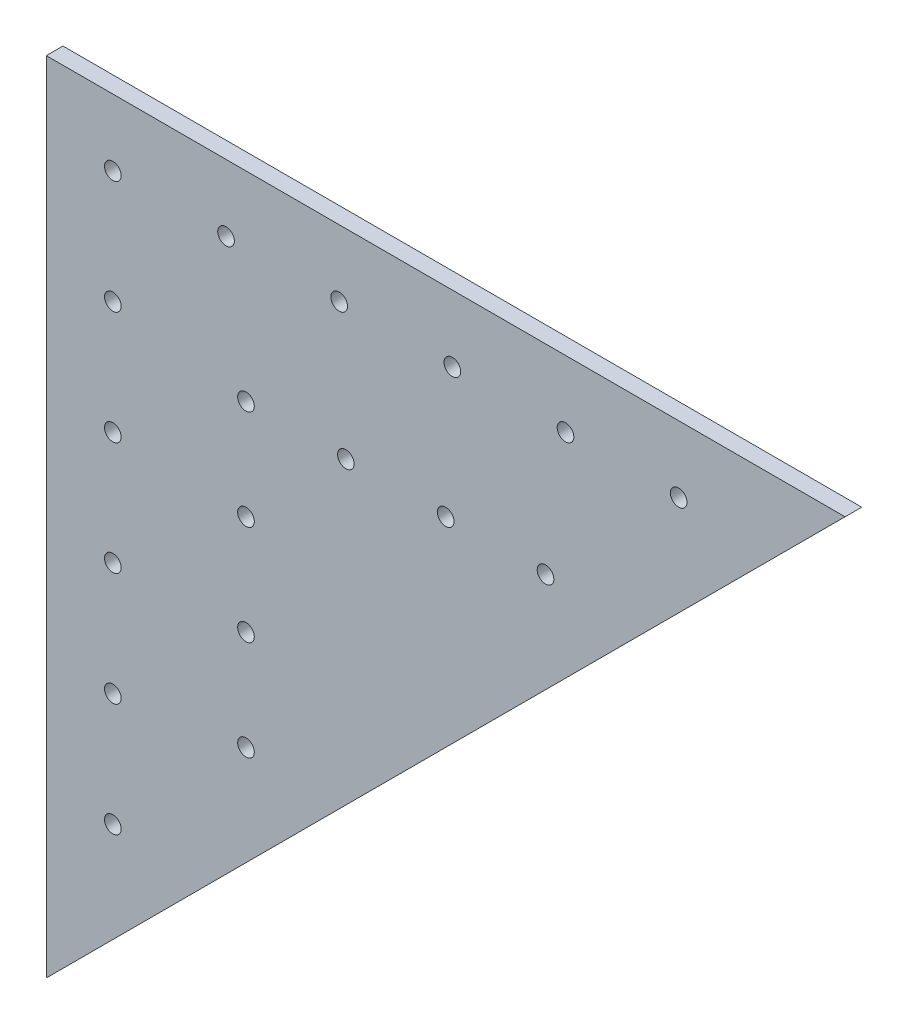
ISO-10303-21;
HEADER;
FILE_DESCRIPTION(('STEP AP214'),'2;1');
FILE_NAME('part.step','',(''),(''),'','','');
FILE_SCHEMA(('AUTOMOTIVE_DESIGN { 1 0 10303 214 1 1 1 1 }'));
ENDSEC;
DATA;
#1=APPLICATION_CONTEXT('core data for automotive mechanical design processes');
#2=APPLICATION_PROTOCOL_DEFINITION('international standard','automotive_design',2000,#1);
#3=PRODUCT_CONTEXT('',#1,'mechanical');
#4=PRODUCT('Part','Part','',(#3));
#5=PRODUCT_RELATED_PRODUCT_CATEGORY('part','',(#4));
#6=PRODUCT_DEFINITION_FORMATION('','',#4);
#7=PRODUCT_DEFINITION_CONTEXT('part definition',#1,'design');
#8=PRODUCT_DEFINITION('design','',#6,#7);
#9=PRODUCT_DEFINITION_SHAPE('','',#8);
#10=(LENGTH_UNIT() NAMED_UNIT(*) SI_UNIT(.MILLI.,.METRE.));
#11=(NAMED_UNIT(*) PLANE_ANGLE_UNIT() SI_UNIT($,.RADIAN.));
#12=(NAMED_UNIT(*) SI_UNIT($,.STERADIAN.) SOLID_ANGLE_UNIT());
#13=UNCERTAINTY_MEASURE_WITH_UNIT(LENGTH_MEASURE(1.E-05),#10,'distance_accuracy_value','');
#14=(GEOMETRIC_REPRESENTATION_CONTEXT(3) GLOBAL_UNCERTAINTY_ASSIGNED_CONTEXT((#13)) GLOBAL_UNIT_ASSIGNED_CONTEXT((#10,
#11,#12)) REPRESENTATION_CONTEXT('',''));
#15=CARTESIAN_POINT('',(0.,0.,0.));
#16=DIRECTION('',(0.,0.,1.));
#17=DIRECTION('',(1.,0.,0.));
#18=AXIS2_PLACEMENT_3D('',#15,#16,#17);
#19=CARTESIAN_POINT('',(152.4,152.4,3.175));
#20=DIRECTION('',(-0.707106781186548,0.707106781186548,0.));
#21=DIRECTION('',(-0.707106781186548,-0.707106781186548,0.));
#22=AXIS2_PLACEMENT_3D('',#19,#20,#21);
#23=PLANE('',#22);
#24=DIRECTION('',(0.707106781186547,0.707106781186547,0.));
#25=VECTOR('',#24,1.);
#26=CARTESIAN_POINT('',(152.4,152.4,0.));
#27=LINE('',#26,#25);
#28=CARTESIAN_POINT('',(0.,0.,0.));
#29=VERTEX_POINT('',#28);
#30=CARTESIAN_POINT('',(152.4,152.4,0.));
#31=VERTEX_POINT('',#30);
#32=EDGE_CURVE('E79',#29,#31,#27,.T.);
#33=ORIENTED_EDGE('',*,*,#32,.T.);
#34=DIRECTION('',(0.,0.,-1.));
#35=VECTOR('',#34,1.);
#36=CARTESIAN_POINT('',(152.4,152.4,3.175));
#37=LINE('',#36,#35);
#38=CARTESIAN_POINT('',(152.4,152.4,3.175));
#39=VERTEX_POINT('',#38);
#40=EDGE_CURVE('E11',#39,#31,#37,.T.);
#41=ORIENTED_EDGE('',*,*,#40,.F.);
#42=DIRECTION('',(0.707106781186547,0.707106781186547,0.));
#43=VECTOR('',#42,1.);
#44=CARTESIAN_POINT('',(152.4,152.4,3.175));
#45=LINE('',#44,#43);
#46=CARTESIAN_POINT('',(0.,0.,3.175));
#47=VERTEX_POINT('',#46);
#48=EDGE_CURVE('E72',#47,#39,#45,.T.);
#49=ORIENTED_EDGE('',*,*,#48,.F.);
#50=DIRECTION('',(0.,0.,-1.));
#51=VECTOR('',#50,1.);
#52=CARTESIAN_POINT('',(0.,0.,3.175));
#53=LINE('',#52,#51);
#54=EDGE_CURVE('E80',#47,#29,#53,.T.);
#55=ORIENTED_EDGE('',*,*,#54,.T.);
#56=EDGE_LOOP('',(#33,#41,#49,#55));
#57=FACE_BOUND('',#56,.T.);
#58=ADVANCED_FACE('F32',(#57),#23,.F.);
#59=CARTESIAN_POINT('',(0.,152.4,3.175));
#60=DIRECTION('',(0.,-1.,0.));
#61=DIRECTION('',(0.,0.,-1.));
#62=AXIS2_PLACEMENT_3D('',#59,#60,#61);
#63=PLANE('',#62);
#64=DIRECTION('',(-1.,0.,0.));
#65=VECTOR('',#64,1.);
#66=CARTESIAN_POINT('',(0.,152.4,0.));
#67=LINE('',#66,#65);
#68=CARTESIAN_POINT('',(0.,152.4,0.));
#69=VERTEX_POINT('',#68);
#70=EDGE_CURVE('E60',#31,#69,#67,.T.);
#71=ORIENTED_EDGE('',*,*,#70,.T.);
#72=DIRECTION('',(0.,0.,-1.));
#73=VECTOR('',#72,1.);
#74=CARTESIAN_POINT('',(0.,152.4,3.175));
#75=LINE('',#74,#73);
#76=CARTESIAN_POINT('',(0.,152.4,3.175));
#77=VERTEX_POINT('',#76);
#78=EDGE_CURVE('E40',#77,#69,#75,.T.);
#79=ORIENTED_EDGE('',*,*,#78,.F.);
#80=DIRECTION('',(-1.,0.,0.));
#81=VECTOR('',#80,1.);
#82=CARTESIAN_POINT('',(0.,152.4,3.175));
#83=LINE('',#82,#81);
#84=EDGE_CURVE('E68',#39,#77,#83,.T.);
#85=ORIENTED_EDGE('',*,*,#84,.F.);
#86=ORIENTED_EDGE('',*,*,#40,.T.);
#87=EDGE_LOOP('',(#71,#79,#85,#86));
#88=FACE_BOUND('',#87,.T.);
#89=ADVANCED_FACE('F69',(#88),#63,.F.);
#90=CARTESIAN_POINT('',(0.,0.,3.175));
#91=DIRECTION('',(1.,0.,0.));
#92=DIRECTION('',(0.,0.,-1.));
#93=AXIS2_PLACEMENT_3D('',#90,#91,#92);
#94=PLANE('',#93);
#95=DIRECTION('',(0.,-1.,0.));
#96=VECTOR('',#95,1.);
#97=CARTESIAN_POINT('',(0.,0.,0.));
#98=LINE('',#97,#96);
#99=EDGE_CURVE('E65',#69,#29,#98,.T.);
#100=ORIENTED_EDGE('',*,*,#99,.T.);
#101=ORIENTED_EDGE('',*,*,#54,.F.);
#102=DIRECTION('',(0.,-1.,0.));
#103=VECTOR('',#102,1.);
#104=CARTESIAN_POINT('',(0.,0.,3.175));
#105=LINE('',#104,#103);
#106=EDGE_CURVE('E48',#77,#47,#105,.T.);
#107=ORIENTED_EDGE('',*,*,#106,.F.);
#108=ORIENTED_EDGE('',*,*,#78,.T.);
#109=EDGE_LOOP('',(#100,#101,#107,#108));
#110=FACE_BOUND('',#109,.T.);
#111=ADVANCED_FACE('F91',(#110),#94,.F.);
#112=CARTESIAN_POINT('',(0.,0.,3.175));
#113=DIRECTION('',(0.,0.,-1.));
#114=DIRECTION('',(-1.,0.,0.));
#115=AXIS2_PLACEMENT_3D('',#112,#113,#114);
#116=PLANE('',#115);
#117=CARTESIAN_POINT('',(12.7,53.34,3.175));
#118=DIRECTION('',(0.,0.,1.));
#119=DIRECTION('',(1.,0.,0.));
#120=AXIS2_PLACEMENT_3D('',#117,#118,#119);
#121=CIRCLE('',#120,1.5875);
#122=CARTESIAN_POINT('',(14.2875,53.34,3.175));
#123=VERTEX_POINT('',#122);
#124=EDGE_CURVE('E310',#123,#123,#121,.T.);
#125=ORIENTED_EDGE('',*,*,#124,.F.);
#126=EDGE_LOOP('',(#125));
#127=FACE_BOUND('',#126,.T.);
#128=CARTESIAN_POINT('',(120.65,139.7,3.175));
#129=DIRECTION('',(0.,0.,1.));
#130=DIRECTION('',(1.,0.,0.));
#131=AXIS2_PLACEMENT_3D('',#128,#129,#130);
#132=CIRCLE('',#131,1.58750000000001);
#133=CARTESIAN_POINT('',(122.2375,139.7,3.175));
#134=VERTEX_POINT('',#133);
#135=EDGE_CURVE('E313',#134,#134,#132,.T.);
#136=ORIENTED_EDGE('',*,*,#135,.F.);
#137=EDGE_LOOP('',(#136));
#138=FACE_BOUND('',#137,.T.);
#139=CARTESIAN_POINT('',(99.06,139.7,3.175));
#140=DIRECTION('',(0.,0.,1.));
#141=DIRECTION('',(1.,0.,0.));
#142=AXIS2_PLACEMENT_3D('',#139,#140,#141);
#143=CIRCLE('',#142,1.58750000000001);
#144=CARTESIAN_POINT('',(100.6475,139.7,3.175));
#145=VERTEX_POINT('',#144);
#146=EDGE_CURVE('E330',#145,#145,#143,.T.);
#147=ORIENTED_EDGE('',*,*,#146,.F.);
#148=EDGE_LOOP('',(#147));
#149=FACE_BOUND('',#148,.T.);
#150=CARTESIAN_POINT('',(38.1,95.25,3.175));
#151=DIRECTION('',(0.,0.,1.));
#152=DIRECTION('',(1.,0.,0.));
#153=AXIS2_PLACEMENT_3D('',#150,#151,#152);
#154=CIRCLE('',#153,1.5875);
#155=CARTESIAN_POINT('',(39.6875,95.25,3.175));
#156=VERTEX_POINT('',#155);
#157=EDGE_CURVE('E324',#156,#156,#154,.T.);
#158=ORIENTED_EDGE('',*,*,#157,.F.);
#159=EDGE_LOOP('',(#158));
#160=FACE_BOUND('',#159,.T.);
#161=CARTESIAN_POINT('',(38.1,57.15,3.175));
#162=DIRECTION('',(0.,0.,1.));
#163=DIRECTION('',(1.,0.,0.));
#164=AXIS2_PLACEMENT_3D('',#161,#162,#163);
#165=CIRCLE('',#164,1.5875);
#166=CARTESIAN_POINT('',(39.6875,57.15,3.175));
#167=VERTEX_POINT('',#166);
#168=EDGE_CURVE('E443',#167,#167,#165,.T.);
#169=ORIENTED_EDGE('',*,*,#168,.F.);
#170=EDGE_LOOP('',(#169));
#171=FACE_BOUND('',#170,.T.);
#172=CARTESIAN_POINT('',(38.1,76.2,3.175));
#173=DIRECTION('',(0.,0.,1.));
#174=DIRECTION('',(1.,0.,0.));
#175=AXIS2_PLACEMENT_3D('',#172,#173,#174);
#176=CIRCLE('',#175,1.5875);
#177=CARTESIAN_POINT('',(39.6875,76.2,3.175));
#178=VERTEX_POINT('',#177);
#179=EDGE_CURVE('E449',#178,#178,#176,.T.);
#180=ORIENTED_EDGE('',*,*,#179,.F.);
#181=EDGE_LOOP('',(#180));
#182=FACE_BOUND('',#181,.T.);
#183=CARTESIAN_POINT('',(95.25,114.3,3.175));
#184=DIRECTION('',(0.,0.,1.));
#185=DIRECTION('',(1.,0.,0.));
#186=AXIS2_PLACEMENT_3D('',#183,#184,#185);
#187=CIRCLE('',#186,1.5875);
#188=CARTESIAN_POINT('',(96.8375,114.3,3.175));
#189=VERTEX_POINT('',#188);
#190=EDGE_CURVE('E455',#189,#189,#187,.T.);
#191=ORIENTED_EDGE('',*,*,#190,.F.);
#192=EDGE_LOOP('',(#191));
#193=FACE_BOUND('',#192,.T.);
#194=CARTESIAN_POINT('',(76.2,114.3,3.175));
#195=DIRECTION('',(0.,0.,1.));
#196=DIRECTION('',(1.,0.,0.));
#197=AXIS2_PLACEMENT_3D('',#194,#195,#196);
#198=CIRCLE('',#197,1.5875);
#199=CARTESIAN_POINT('',(77.7875,114.3,3.175));
#200=VERTEX_POINT('',#199);
#201=EDGE_CURVE('E434',#200,#200,#198,.T.);
#202=ORIENTED_EDGE('',*,*,#201,.F.);
#203=EDGE_LOOP('',(#202));
#204=FACE_BOUND('',#203,.T.);
#205=CARTESIAN_POINT('',(12.7,31.75,3.175));
#206=DIRECTION('',(0.,0.,1.));
#207=DIRECTION('',(1.,0.,0.));
#208=AXIS2_PLACEMENT_3D('',#205,#206,#207);
#209=CIRCLE('',#208,1.5875);
#210=CARTESIAN_POINT('',(14.2875,31.75,3.175));
#211=VERTEX_POINT('',#210);
#212=EDGE_CURVE('E316',#211,#211,#209,.T.);
#213=ORIENTED_EDGE('',*,*,#212,.F.);
#214=EDGE_LOOP('',(#213));
#215=FACE_BOUND('',#214,.T.);
#216=CARTESIAN_POINT('',(38.1,114.3,3.175));
#217=DIRECTION('',(0.,0.,1.));
#218=DIRECTION('',(1.,0.,0.));
#219=AXIS2_PLACEMENT_3D('',#216,#217,#218);
#220=CIRCLE('',#219,1.5875);
#221=CARTESIAN_POINT('',(39.6875,114.3,3.175));
#222=VERTEX_POINT('',#221);
#223=EDGE_CURVE('E349',#222,#222,#220,.T.);
#224=ORIENTED_EDGE('',*,*,#223,.F.);
#225=EDGE_LOOP('',(#224));
#226=FACE_BOUND('',#225,.T.);
#227=CARTESIAN_POINT('',(77.47,139.7,3.175));
#228=DIRECTION('',(0.,0.,1.));
#229=DIRECTION('',(1.,0.,0.));
#230=AXIS2_PLACEMENT_3D('',#227,#228,#229);
#231=CIRCLE('',#230,1.58749999999999);
#232=CARTESIAN_POINT('',(79.0575,139.7,3.175));
#233=VERTEX_POINT('',#232);
#234=EDGE_CURVE('E362',#233,#233,#231,.T.);
#235=ORIENTED_EDGE('',*,*,#234,.F.);
#236=EDGE_LOOP('',(#235));
#237=FACE_BOUND('',#236,.T.);
#238=CARTESIAN_POINT('',(55.88,139.7,3.175));
#239=DIRECTION('',(0.,0.,1.));
#240=DIRECTION('',(1.,0.,0.));
#241=AXIS2_PLACEMENT_3D('',#238,#239,#240);
#242=CIRCLE('',#241,1.5875);
#243=CARTESIAN_POINT('',(57.4675,139.7,3.175));
#244=VERTEX_POINT('',#243);
#245=EDGE_CURVE('E361',#244,#244,#242,.T.);
#246=ORIENTED_EDGE('',*,*,#245,.F.);
#247=EDGE_LOOP('',(#246));
#248=FACE_BOUND('',#247,.T.);
#249=CARTESIAN_POINT('',(34.29,139.7,3.175));
#250=DIRECTION('',(0.,0.,1.));
#251=DIRECTION('',(1.,0.,0.));
#252=AXIS2_PLACEMENT_3D('',#249,#250,#251);
#253=CIRCLE('',#252,1.58750000000001);
#254=CARTESIAN_POINT('',(35.8775,139.7,3.175));
#255=VERTEX_POINT('',#254);
#256=EDGE_CURVE('E373',#255,#255,#253,.T.);
#257=ORIENTED_EDGE('',*,*,#256,.F.);
#258=EDGE_LOOP('',(#257));
#259=FACE_BOUND('',#258,.T.);
#260=CARTESIAN_POINT('',(57.15,114.3,3.175));
#261=DIRECTION('',(0.,0.,1.));
#262=DIRECTION('',(1.,0.,0.));
#263=AXIS2_PLACEMENT_3D('',#260,#261,#262);
#264=CIRCLE('',#263,1.5875);
#265=CARTESIAN_POINT('',(58.7375,114.3,3.175));
#266=VERTEX_POINT('',#265);
#267=EDGE_CURVE('E323',#266,#266,#264,.T.);
#268=ORIENTED_EDGE('',*,*,#267,.F.);
#269=EDGE_LOOP('',(#268));
#270=FACE_BOUND('',#269,.T.);
#271=CARTESIAN_POINT('',(12.7,74.93,3.175));
#272=DIRECTION('',(0.,0.,1.));
#273=DIRECTION('',(1.,0.,0.));
#274=AXIS2_PLACEMENT_3D('',#271,#272,#273);
#275=CIRCLE('',#274,1.5875);
#276=CARTESIAN_POINT('',(14.2875,74.93,3.175));
#277=VERTEX_POINT('',#276);
#278=EDGE_CURVE('E338',#277,#277,#275,.T.);
#279=ORIENTED_EDGE('',*,*,#278,.F.);
#280=EDGE_LOOP('',(#279));
#281=FACE_BOUND('',#280,.T.);
#282=CARTESIAN_POINT('',(12.7,96.52,3.175));
#283=DIRECTION('',(0.,0.,1.));
#284=DIRECTION('',(1.,0.,0.));
#285=AXIS2_PLACEMENT_3D('',#282,#283,#284);
#286=CIRCLE('',#285,1.5875);
#287=CARTESIAN_POINT('',(14.2875,96.52,3.175));
#288=VERTEX_POINT('',#287);
#289=EDGE_CURVE('E337',#288,#288,#286,.T.);
#290=ORIENTED_EDGE('',*,*,#289,.F.);
#291=EDGE_LOOP('',(#290));
#292=FACE_BOUND('',#291,.T.);
#293=CARTESIAN_POINT('',(12.7,118.11,3.175));
#294=DIRECTION('',(0.,0.,1.));
#295=DIRECTION('',(1.,0.,0.));
#296=AXIS2_PLACEMENT_3D('',#293,#294,#295);
#297=CIRCLE('',#296,1.5875);
#298=CARTESIAN_POINT('',(14.2875,118.11,3.175));
#299=VERTEX_POINT('',#298);
#300=EDGE_CURVE('E350',#299,#299,#297,.T.);
#301=ORIENTED_EDGE('',*,*,#300,.F.);
#302=EDGE_LOOP('',(#301));
#303=FACE_BOUND('',#302,.T.);
#304=CARTESIAN_POINT('',(12.7,139.7,3.175));
#305=DIRECTION('',(0.,0.,1.));
#306=DIRECTION('',(1.,0.,0.));
#307=AXIS2_PLACEMENT_3D('',#304,#305,#306);
#308=CIRCLE('',#307,1.5875);
#309=CARTESIAN_POINT('',(14.2875,139.7,3.175));
#310=VERTEX_POINT('',#309);
#311=EDGE_CURVE('E86',#310,#310,#308,.T.);
#312=ORIENTED_EDGE('',*,*,#311,.F.);
#313=EDGE_LOOP('',(#312));
#314=FACE_BOUND('',#313,.T.);
#315=ORIENTED_EDGE('',*,*,#48,.T.);
#316=ORIENTED_EDGE('',*,*,#84,.T.);
#317=ORIENTED_EDGE('',*,*,#106,.T.);
#318=EDGE_LOOP('',(#315,#316,#317));
#319=FACE_BOUND('',#318,.T.);
#320=ADVANCED_FACE('F75',(#127,#138,#149,#160,#171,#182,#193,#204,#215,#226,#237,#248,#259,#270,
#281,#292,#303,#314,#319),#116,.F.);
#321=CARTESIAN_POINT('',(0.,0.,0.));
#322=DIRECTION('',(0.,0.,-1.));
#323=DIRECTION('',(-1.,0.,0.));
#324=AXIS2_PLACEMENT_3D('',#321,#322,#323);
#325=PLANE('',#324);
#326=CARTESIAN_POINT('',(12.7,53.34,0.));
#327=DIRECTION('',(0.,0.,1.));
#328=DIRECTION('',(1.,0.,0.));
#329=AXIS2_PLACEMENT_3D('',#326,#327,#328);
#330=CIRCLE('',#329,1.5875);
#331=CARTESIAN_POINT('',(14.2875,53.34,0.));
#332=VERTEX_POINT('',#331);
#333=EDGE_CURVE('E307',#332,#332,#330,.T.);
#334=ORIENTED_EDGE('',*,*,#333,.T.);
#335=EDGE_LOOP('',(#334));
#336=FACE_BOUND('',#335,.T.);
#337=CARTESIAN_POINT('',(120.65,139.7,0.));
#338=DIRECTION('',(0.,0.,1.));
#339=DIRECTION('',(1.,0.,0.));
#340=AXIS2_PLACEMENT_3D('',#337,#338,#339);
#341=CIRCLE('',#340,1.58750000000001);
#342=CARTESIAN_POINT('',(122.2375,139.7,0.));
#343=VERTEX_POINT('',#342);
#344=EDGE_CURVE('E333',#343,#343,#341,.T.);
#345=ORIENTED_EDGE('',*,*,#344,.T.);
#346=EDGE_LOOP('',(#345));
#347=FACE_BOUND('',#346,.T.);
#348=CARTESIAN_POINT('',(99.06,139.7,0.));
#349=DIRECTION('',(0.,0.,1.));
#350=DIRECTION('',(1.,0.,0.));
#351=AXIS2_PLACEMENT_3D('',#348,#349,#350);
#352=CIRCLE('',#351,1.58750000000001);
#353=CARTESIAN_POINT('',(100.6475,139.7,0.));
#354=VERTEX_POINT('',#353);
#355=EDGE_CURVE('E327',#354,#354,#352,.T.);
#356=ORIENTED_EDGE('',*,*,#355,.T.);
#357=EDGE_LOOP('',(#356));
#358=FACE_BOUND('',#357,.T.);
#359=CARTESIAN_POINT('',(38.1,95.25,0.));
#360=DIRECTION('',(0.,0.,1.));
#361=DIRECTION('',(1.,0.,0.));
#362=AXIS2_PLACEMENT_3D('',#359,#360,#361);
#363=CIRCLE('',#362,1.5875);
#364=CARTESIAN_POINT('',(39.6875,95.25,0.));
#365=VERTEX_POINT('',#364);
#366=EDGE_CURVE('E320',#365,#365,#363,.T.);
#367=ORIENTED_EDGE('',*,*,#366,.T.);
#368=EDGE_LOOP('',(#367));
#369=FACE_BOUND('',#368,.T.);
#370=CARTESIAN_POINT('',(38.1,57.15,0.));
#371=DIRECTION('',(0.,0.,1.));
#372=DIRECTION('',(1.,0.,0.));
#373=AXIS2_PLACEMENT_3D('',#370,#371,#372);
#374=CIRCLE('',#373,1.5875);
#375=CARTESIAN_POINT('',(39.6875,57.15,0.));
#376=VERTEX_POINT('',#375);
#377=EDGE_CURVE('E446',#376,#376,#374,.T.);
#378=ORIENTED_EDGE('',*,*,#377,.T.);
#379=EDGE_LOOP('',(#378));
#380=FACE_BOUND('',#379,.T.);
#381=CARTESIAN_POINT('',(38.1,76.2,0.));
#382=DIRECTION('',(0.,0.,1.));
#383=DIRECTION('',(1.,0.,0.));
#384=AXIS2_PLACEMENT_3D('',#381,#382,#383);
#385=CIRCLE('',#384,1.5875);
#386=CARTESIAN_POINT('',(39.6875,76.2,0.));
#387=VERTEX_POINT('',#386);
#388=EDGE_CURVE('E452',#387,#387,#385,.T.);
#389=ORIENTED_EDGE('',*,*,#388,.T.);
#390=EDGE_LOOP('',(#389));
#391=FACE_BOUND('',#390,.T.);
#392=CARTESIAN_POINT('',(95.25,114.3,0.));
#393=DIRECTION('',(0.,0.,1.));
#394=DIRECTION('',(1.,0.,0.));
#395=AXIS2_PLACEMENT_3D('',#392,#393,#394);
#396=CIRCLE('',#395,1.5875);
#397=CARTESIAN_POINT('',(96.8375,114.3,0.));
#398=VERTEX_POINT('',#397);
#399=EDGE_CURVE('E438',#398,#398,#396,.T.);
#400=ORIENTED_EDGE('',*,*,#399,.T.);
#401=EDGE_LOOP('',(#400));
#402=FACE_BOUND('',#401,.T.);
#403=CARTESIAN_POINT('',(76.2,114.3,0.));
#404=DIRECTION('',(0.,0.,1.));
#405=DIRECTION('',(1.,0.,0.));
#406=AXIS2_PLACEMENT_3D('',#403,#404,#405);
#407=CIRCLE('',#406,1.5875);
#408=CARTESIAN_POINT('',(77.7875,114.3,0.));
#409=VERTEX_POINT('',#408);
#410=EDGE_CURVE('E437',#409,#409,#407,.T.);
#411=ORIENTED_EDGE('',*,*,#410,.T.);
#412=EDGE_LOOP('',(#411));
#413=FACE_BOUND('',#412,.T.);
#414=CARTESIAN_POINT('',(12.7,31.75,0.));
#415=DIRECTION('',(0.,0.,1.));
#416=DIRECTION('',(1.,0.,0.));
#417=AXIS2_PLACEMENT_3D('',#414,#415,#416);
#418=CIRCLE('',#417,1.5875);
#419=CARTESIAN_POINT('',(14.2875,31.75,0.));
#420=VERTEX_POINT('',#419);
#421=EDGE_CURVE('E311',#420,#420,#418,.T.);
#422=ORIENTED_EDGE('',*,*,#421,.T.);
#423=EDGE_LOOP('',(#422));
#424=FACE_BOUND('',#423,.T.);
#425=CARTESIAN_POINT('',(38.1,114.3,0.));
#426=DIRECTION('',(0.,0.,1.));
#427=DIRECTION('',(1.,0.,0.));
#428=AXIS2_PLACEMENT_3D('',#425,#426,#427);
#429=CIRCLE('',#428,1.5875);
#430=CARTESIAN_POINT('',(39.6875,114.3,0.));
#431=VERTEX_POINT('',#430);
#432=EDGE_CURVE('E365',#431,#431,#429,.T.);
#433=ORIENTED_EDGE('',*,*,#432,.T.);
#434=EDGE_LOOP('',(#433));
#435=FACE_BOUND('',#434,.T.);
#436=CARTESIAN_POINT('',(77.47,139.7,0.));
#437=DIRECTION('',(0.,0.,1.));
#438=DIRECTION('',(1.,0.,0.));
#439=AXIS2_PLACEMENT_3D('',#436,#437,#438);
#440=CIRCLE('',#439,1.58749999999999);
#441=CARTESIAN_POINT('',(79.0575,139.7,0.));
#442=VERTEX_POINT('',#441);
#443=EDGE_CURVE('E358',#442,#442,#440,.T.);
#444=ORIENTED_EDGE('',*,*,#443,.T.);
#445=EDGE_LOOP('',(#444));
#446=FACE_BOUND('',#445,.T.);
#447=CARTESIAN_POINT('',(55.88,139.7,0.));
#448=DIRECTION('',(0.,0.,1.));
#449=DIRECTION('',(1.,0.,0.));
#450=AXIS2_PLACEMENT_3D('',#447,#448,#449);
#451=CIRCLE('',#450,1.5875);
#452=CARTESIAN_POINT('',(57.4675,139.7,0.));
#453=VERTEX_POINT('',#452);
#454=EDGE_CURVE('E376',#453,#453,#451,.T.);
#455=ORIENTED_EDGE('',*,*,#454,.T.);
#456=EDGE_LOOP('',(#455));
#457=FACE_BOUND('',#456,.T.);
#458=CARTESIAN_POINT('',(34.29,139.7,0.));
#459=DIRECTION('',(0.,0.,1.));
#460=DIRECTION('',(1.,0.,0.));
#461=AXIS2_PLACEMENT_3D('',#458,#459,#460);
#462=CIRCLE('',#461,1.58750000000001);
#463=CARTESIAN_POINT('',(35.8775,139.7,0.));
#464=VERTEX_POINT('',#463);
#465=EDGE_CURVE('E370',#464,#464,#462,.T.);
#466=ORIENTED_EDGE('',*,*,#465,.T.);
#467=EDGE_LOOP('',(#466));
#468=FACE_BOUND('',#467,.T.);
#469=CARTESIAN_POINT('',(57.15,114.3,0.));
#470=DIRECTION('',(0.,0.,1.));
#471=DIRECTION('',(1.,0.,0.));
#472=AXIS2_PLACEMENT_3D('',#469,#470,#471);
#473=CIRCLE('',#472,1.5875);
#474=CARTESIAN_POINT('',(58.7375,114.3,0.));
#475=VERTEX_POINT('',#474);
#476=EDGE_CURVE('E341',#475,#475,#473,.T.);
#477=ORIENTED_EDGE('',*,*,#476,.T.);
#478=EDGE_LOOP('',(#477));
#479=FACE_BOUND('',#478,.T.);
#480=CARTESIAN_POINT('',(12.7,74.93,0.));
#481=DIRECTION('',(0.,0.,1.));
#482=DIRECTION('',(1.,0.,0.));
#483=AXIS2_PLACEMENT_3D('',#480,#481,#482);
#484=CIRCLE('',#483,1.5875);
#485=CARTESIAN_POINT('',(14.2875,74.93,0.));
#486=VERTEX_POINT('',#485);
#487=EDGE_CURVE('E334',#486,#486,#484,.T.);
#488=ORIENTED_EDGE('',*,*,#487,.T.);
#489=EDGE_LOOP('',(#488));
#490=FACE_BOUND('',#489,.T.);
#491=CARTESIAN_POINT('',(12.7,96.52,0.));
#492=DIRECTION('',(0.,0.,1.));
#493=DIRECTION('',(1.,0.,0.));
#494=AXIS2_PLACEMENT_3D('',#491,#492,#493);
#495=CIRCLE('',#494,1.5875);
#496=CARTESIAN_POINT('',(14.2875,96.52,0.));
#497=VERTEX_POINT('',#496);
#498=EDGE_CURVE('E353',#497,#497,#495,.T.);
#499=ORIENTED_EDGE('',*,*,#498,.T.);
#500=EDGE_LOOP('',(#499));
#501=FACE_BOUND('',#500,.T.);
#502=CARTESIAN_POINT('',(12.7,118.11,0.));
#503=DIRECTION('',(0.,0.,1.));
#504=DIRECTION('',(1.,0.,0.));
#505=AXIS2_PLACEMENT_3D('',#502,#503,#504);
#506=CIRCLE('',#505,1.5875);
#507=CARTESIAN_POINT('',(14.2875,118.11,0.));
#508=VERTEX_POINT('',#507);
#509=EDGE_CURVE('E346',#508,#508,#506,.T.);
#510=ORIENTED_EDGE('',*,*,#509,.T.);
#511=EDGE_LOOP('',(#510));
#512=FACE_BOUND('',#511,.T.);
#513=CARTESIAN_POINT('',(12.7,139.7,0.));
#514=DIRECTION('',(0.,0.,1.));
#515=DIRECTION('',(1.,0.,0.));
#516=AXIS2_PLACEMENT_3D('',#513,#514,#515);
#517=CIRCLE('',#516,1.5875);
#518=CARTESIAN_POINT('',(14.2875,139.7,0.));
#519=VERTEX_POINT('',#518);
#520=EDGE_CURVE('E82',#519,#519,#517,.T.);
#521=ORIENTED_EDGE('',*,*,#520,.T.);
#522=EDGE_LOOP('',(#521));
#523=FACE_BOUND('',#522,.T.);
#524=ORIENTED_EDGE('',*,*,#32,.F.);
#525=ORIENTED_EDGE('',*,*,#99,.F.);
#526=ORIENTED_EDGE('',*,*,#70,.F.);
#527=EDGE_LOOP('',(#524,#525,#526));
#528=FACE_BOUND('',#527,.T.);
#529=ADVANCED_FACE('F92',(#336,#347,#358,#369,#380,#391,#402,#413,#424,#435,#446,#457,#468,#479,
#490,#501,#512,#523,#528),#325,.T.);
#530=CARTESIAN_POINT('',(12.7,139.7,0.));
#531=DIRECTION('',(0.,0.,1.));
#532=DIRECTION('',(1.,0.,0.));
#533=AXIS2_PLACEMENT_3D('',#530,#531,#532);
#534=CYLINDRICAL_SURFACE('',#533,1.5875);
#535=ORIENTED_EDGE('',*,*,#520,.F.);
#536=EDGE_LOOP('',(#535));
#537=FACE_BOUND('',#536,.T.);
#538=ORIENTED_EDGE('',*,*,#311,.T.);
#539=EDGE_LOOP('',(#538));
#540=FACE_BOUND('',#539,.T.);
#541=ADVANCED_FACE('F94',(#537,#540),#534,.F.);
#542=CARTESIAN_POINT('',(12.7,118.11,0.));
#543=DIRECTION('',(0.,0.,1.));
#544=DIRECTION('',(1.,0.,0.));
#545=AXIS2_PLACEMENT_3D('',#542,#543,#544);
#546=CYLINDRICAL_SURFACE('',#545,1.5875);
#547=ORIENTED_EDGE('',*,*,#509,.F.);
#548=EDGE_LOOP('',(#547));
#549=FACE_BOUND('',#548,.T.);
#550=ORIENTED_EDGE('',*,*,#300,.T.);
#551=EDGE_LOOP('',(#550));
#552=FACE_BOUND('',#551,.T.);
#553=ADVANCED_FACE('F101',(#549,#552),#546,.F.);
#554=CARTESIAN_POINT('',(12.7,96.52,0.));
#555=DIRECTION('',(0.,0.,1.));
#556=DIRECTION('',(1.,0.,0.));
#557=AXIS2_PLACEMENT_3D('',#554,#555,#556);
#558=CYLINDRICAL_SURFACE('',#557,1.5875);
#559=ORIENTED_EDGE('',*,*,#498,.F.);
#560=EDGE_LOOP('',(#559));
#561=FACE_BOUND('',#560,.T.);
#562=ORIENTED_EDGE('',*,*,#289,.T.);
#563=EDGE_LOOP('',(#562));
#564=FACE_BOUND('',#563,.T.);
#565=ADVANCED_FACE('F141',(#561,#564),#558,.F.);
#566=CARTESIAN_POINT('',(12.7,74.93,0.));
#567=DIRECTION('',(0.,0.,1.));
#568=DIRECTION('',(1.,0.,0.));
#569=AXIS2_PLACEMENT_3D('',#566,#567,#568);
#570=CYLINDRICAL_SURFACE('',#569,1.5875);
#571=ORIENTED_EDGE('',*,*,#487,.F.);
#572=EDGE_LOOP('',(#571));
#573=FACE_BOUND('',#572,.T.);
#574=ORIENTED_EDGE('',*,*,#278,.T.);
#575=EDGE_LOOP('',(#574));
#576=FACE_BOUND('',#575,.T.);
#577=ADVANCED_FACE('F151',(#573,#576),#570,.F.);
#578=CARTESIAN_POINT('',(57.15,114.3,0.));
#579=DIRECTION('',(0.,0.,1.));
#580=DIRECTION('',(1.,0.,0.));
#581=AXIS2_PLACEMENT_3D('',#578,#579,#580);
#582=CYLINDRICAL_SURFACE('',#581,1.5875);
#583=ORIENTED_EDGE('',*,*,#476,.F.);
#584=EDGE_LOOP('',(#583));
#585=FACE_BOUND('',#584,.T.);
#586=ORIENTED_EDGE('',*,*,#267,.T.);
#587=EDGE_LOOP('',(#586));
#588=FACE_BOUND('',#587,.T.);
#589=ADVANCED_FACE('F161',(#585,#588),#582,.F.);
#590=CARTESIAN_POINT('',(34.29,139.7,0.));
#591=DIRECTION('',(0.,0.,1.));
#592=DIRECTION('',(1.,0.,0.));
#593=AXIS2_PLACEMENT_3D('',#590,#591,#592);
#594=CYLINDRICAL_SURFACE('',#593,1.58750000000001);
#595=ORIENTED_EDGE('',*,*,#465,.F.);
#596=EDGE_LOOP('',(#595));
#597=FACE_BOUND('',#596,.T.);
#598=ORIENTED_EDGE('',*,*,#256,.T.);
#599=EDGE_LOOP('',(#598));
#600=FACE_BOUND('',#599,.T.);
#601=ADVANCED_FACE('F171',(#597,#600),#594,.F.);
#602=CARTESIAN_POINT('',(55.88,139.7,0.));
#603=DIRECTION('',(0.,0.,1.));
#604=DIRECTION('',(1.,0.,0.));
#605=AXIS2_PLACEMENT_3D('',#602,#603,#604);
#606=CYLINDRICAL_SURFACE('',#605,1.5875);
#607=ORIENTED_EDGE('',*,*,#454,.F.);
#608=EDGE_LOOP('',(#607));
#609=FACE_BOUND('',#608,.T.);
#610=ORIENTED_EDGE('',*,*,#245,.T.);
#611=EDGE_LOOP('',(#610));
#612=FACE_BOUND('',#611,.T.);
#613=ADVANCED_FACE('F181',(#609,#612),#606,.F.);
#614=CARTESIAN_POINT('',(77.47,139.7,0.));
#615=DIRECTION('',(0.,0.,1.));
#616=DIRECTION('',(1.,0.,0.));
#617=AXIS2_PLACEMENT_3D('',#614,#615,#616);
#618=CYLINDRICAL_SURFACE('',#617,1.58749999999999);
#619=ORIENTED_EDGE('',*,*,#443,.F.);
#620=EDGE_LOOP('',(#619));
#621=FACE_BOUND('',#620,.T.);
#622=ORIENTED_EDGE('',*,*,#234,.T.);
#623=EDGE_LOOP('',(#622));
#624=FACE_BOUND('',#623,.T.);
#625=ADVANCED_FACE('F191',(#621,#624),#618,.F.);
#626=CARTESIAN_POINT('',(38.1,114.3,0.));
#627=DIRECTION('',(0.,0.,1.));
#628=DIRECTION('',(1.,0.,0.));
#629=AXIS2_PLACEMENT_3D('',#626,#627,#628);
#630=CYLINDRICAL_SURFACE('',#629,1.5875);
#631=ORIENTED_EDGE('',*,*,#432,.F.);
#632=EDGE_LOOP('',(#631));
#633=FACE_BOUND('',#632,.T.);
#634=ORIENTED_EDGE('',*,*,#223,.T.);
#635=EDGE_LOOP('',(#634));
#636=FACE_BOUND('',#635,.T.);
#637=ADVANCED_FACE('F201',(#633,#636),#630,.F.);
#638=CARTESIAN_POINT('',(12.7,31.75,0.));
#639=DIRECTION('',(0.,0.,1.));
#640=DIRECTION('',(1.,0.,0.));
#641=AXIS2_PLACEMENT_3D('',#638,#639,#640);
#642=CYLINDRICAL_SURFACE('',#641,1.5875);
#643=ORIENTED_EDGE('',*,*,#421,.F.);
#644=EDGE_LOOP('',(#643));
#645=FACE_BOUND('',#644,.T.);
#646=ORIENTED_EDGE('',*,*,#212,.T.);
#647=EDGE_LOOP('',(#646));
#648=FACE_BOUND('',#647,.T.);
#649=ADVANCED_FACE('F211',(#645,#648),#642,.F.);
#650=CARTESIAN_POINT('',(76.2,114.3,0.));
#651=DIRECTION('',(0.,0.,1.));
#652=DIRECTION('',(1.,0.,0.));
#653=AXIS2_PLACEMENT_3D('',#650,#651,#652);
#654=CYLINDRICAL_SURFACE('',#653,1.5875);
#655=ORIENTED_EDGE('',*,*,#410,.F.);
#656=EDGE_LOOP('',(#655));
#657=FACE_BOUND('',#656,.T.);
#658=ORIENTED_EDGE('',*,*,#201,.T.);
#659=EDGE_LOOP('',(#658));
#660=FACE_BOUND('',#659,.T.);
#661=ADVANCED_FACE('F221',(#657,#660),#654,.F.);
#662=CARTESIAN_POINT('',(95.25,114.3,0.));
#663=DIRECTION('',(0.,0.,1.));
#664=DIRECTION('',(1.,0.,0.));
#665=AXIS2_PLACEMENT_3D('',#662,#663,#664);
#666=CYLINDRICAL_SURFACE('',#665,1.5875);
#667=ORIENTED_EDGE('',*,*,#399,.F.);
#668=EDGE_LOOP('',(#667));
#669=FACE_BOUND('',#668,.T.);
#670=ORIENTED_EDGE('',*,*,#190,.T.);
#671=EDGE_LOOP('',(#670));
#672=FACE_BOUND('',#671,.T.);
#673=ADVANCED_FACE('F231',(#669,#672),#666,.F.);
#674=CARTESIAN_POINT('',(38.1,76.2,0.));
#675=DIRECTION('',(0.,0.,1.));
#676=DIRECTION('',(1.,0.,0.));
#677=AXIS2_PLACEMENT_3D('',#674,#675,#676);
#678=CYLINDRICAL_SURFACE('',#677,1.5875);
#679=ORIENTED_EDGE('',*,*,#388,.F.);
#680=EDGE_LOOP('',(#679));
#681=FACE_BOUND('',#680,.T.);
#682=ORIENTED_EDGE('',*,*,#179,.T.);
#683=EDGE_LOOP('',(#682));
#684=FACE_BOUND('',#683,.T.);
#685=ADVANCED_FACE('F241',(#681,#684),#678,.F.);
#686=CARTESIAN_POINT('',(38.1,57.15,0.));
#687=DIRECTION('',(0.,0.,1.));
#688=DIRECTION('',(1.,0.,0.));
#689=AXIS2_PLACEMENT_3D('',#686,#687,#688);
#690=CYLINDRICAL_SURFACE('',#689,1.5875);
#691=ORIENTED_EDGE('',*,*,#377,.F.);
#692=EDGE_LOOP('',(#691));
#693=FACE_BOUND('',#692,.T.);
#694=ORIENTED_EDGE('',*,*,#168,.T.);
#695=EDGE_LOOP('',(#694));
#696=FACE_BOUND('',#695,.T.);
#697=ADVANCED_FACE('F251',(#693,#696),#690,.F.);
#698=CARTESIAN_POINT('',(38.1,95.25,0.));
#699=DIRECTION('',(0.,0.,1.));
#700=DIRECTION('',(1.,0.,0.));
#701=AXIS2_PLACEMENT_3D('',#698,#699,#700);
#702=CYLINDRICAL_SURFACE('',#701,1.5875);
#703=ORIENTED_EDGE('',*,*,#366,.F.);
#704=EDGE_LOOP('',(#703));
#705=FACE_BOUND('',#704,.T.);
#706=ORIENTED_EDGE('',*,*,#157,.T.);
#707=EDGE_LOOP('',(#706));
#708=FACE_BOUND('',#707,.T.);
#709=ADVANCED_FACE('F261',(#705,#708),#702,.F.);
#710=CARTESIAN_POINT('',(99.06,139.7,0.));
#711=DIRECTION('',(0.,0.,1.));
#712=DIRECTION('',(1.,0.,0.));
#713=AXIS2_PLACEMENT_3D('',#710,#711,#712);
#714=CYLINDRICAL_SURFACE('',#713,1.58750000000001);
#715=ORIENTED_EDGE('',*,*,#355,.F.);
#716=EDGE_LOOP('',(#715));
#717=FACE_BOUND('',#716,.T.);
#718=ORIENTED_EDGE('',*,*,#146,.T.);
#719=EDGE_LOOP('',(#718));
#720=FACE_BOUND('',#719,.T.);
#721=ADVANCED_FACE('F271',(#717,#720),#714,.F.);
#722=CARTESIAN_POINT('',(120.65,139.7,0.));
#723=DIRECTION('',(0.,0.,1.));
#724=DIRECTION('',(1.,0.,0.));
#725=AXIS2_PLACEMENT_3D('',#722,#723,#724);
#726=CYLINDRICAL_SURFACE('',#725,1.58750000000001);
#727=ORIENTED_EDGE('',*,*,#344,.F.);
#728=EDGE_LOOP('',(#727));
#729=FACE_BOUND('',#728,.T.);
#730=ORIENTED_EDGE('',*,*,#135,.T.);
#731=EDGE_LOOP('',(#730));
#732=FACE_BOUND('',#731,.T.);
#733=ADVANCED_FACE('F281',(#729,#732),#726,.F.);
#734=CARTESIAN_POINT('',(12.7,53.34,0.));
#735=DIRECTION('',(0.,0.,1.));
#736=DIRECTION('',(1.,0.,0.));
#737=AXIS2_PLACEMENT_3D('',#734,#735,#736);
#738=CYLINDRICAL_SURFACE('',#737,1.5875);
#739=ORIENTED_EDGE('',*,*,#333,.F.);
#740=EDGE_LOOP('',(#739));
#741=FACE_BOUND('',#740,.T.);
#742=ORIENTED_EDGE('',*,*,#124,.T.);
#743=EDGE_LOOP('',(#742));
#744=FACE_BOUND('',#743,.T.);
#745=ADVANCED_FACE('F291',(#741,#744),#738,.F.);
#746=CLOSED_SHELL('',(#58,#89,#111,#320,#529,#541,#553,#565,#577,#589,#601,#613,#625,#637,#649,
#661,#673,#685,#697,#709,#721,#733,#745));
#747=MANIFOLD_SOLID_BREP('B2',#746);
#748=ADVANCED_BREP_SHAPE_REPRESENTATION('',(#18,#747),#14);
#749=SHAPE_DEFINITION_REPRESENTATION(#9,#748);
ENDSEC;
END-ISO-10303-21;
